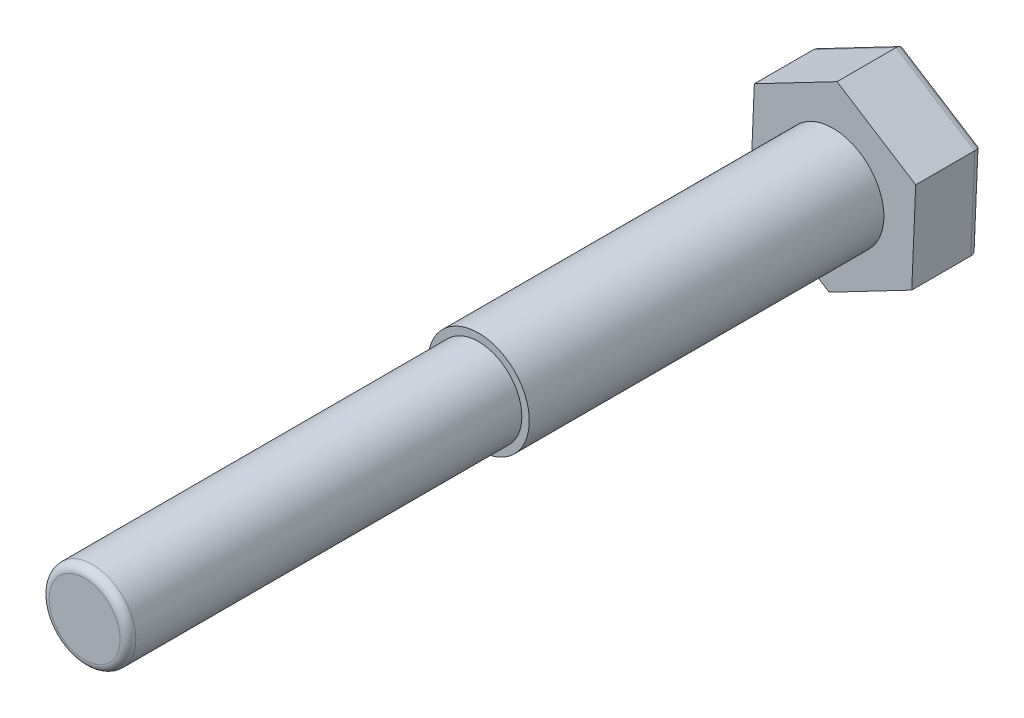
ISO-10303-21;
HEADER;
FILE_DESCRIPTION(('STEP AP214'),'2;1');
FILE_NAME('part.step','',(''),(''),'','','');
FILE_SCHEMA(('AUTOMOTIVE_DESIGN { 1 0 10303 214 1 1 1 1 }'));
ENDSEC;
DATA;
#1=APPLICATION_CONTEXT('core data for automotive mechanical design processes');
#2=APPLICATION_PROTOCOL_DEFINITION('international standard','automotive_design',2000,#1);
#3=PRODUCT_CONTEXT('',#1,'mechanical');
#4=PRODUCT('Part','Part','',(#3));
#5=PRODUCT_RELATED_PRODUCT_CATEGORY('part','',(#4));
#6=PRODUCT_DEFINITION_FORMATION('','',#4);
#7=PRODUCT_DEFINITION_CONTEXT('part definition',#1,'design');
#8=PRODUCT_DEFINITION('design','',#6,#7);
#9=PRODUCT_DEFINITION_SHAPE('','',#8);
#10=(LENGTH_UNIT() NAMED_UNIT(*) SI_UNIT(.MILLI.,.METRE.));
#11=(NAMED_UNIT(*) PLANE_ANGLE_UNIT() SI_UNIT($,.RADIAN.));
#12=(NAMED_UNIT(*) SI_UNIT($,.STERADIAN.) SOLID_ANGLE_UNIT());
#13=UNCERTAINTY_MEASURE_WITH_UNIT(LENGTH_MEASURE(1.E-05),#10,'distance_accuracy_value','');
#14=(GEOMETRIC_REPRESENTATION_CONTEXT(3) GLOBAL_UNCERTAINTY_ASSIGNED_CONTEXT((#13)) GLOBAL_UNIT_ASSIGNED_CONTEXT((#10,
#11,#12)) REPRESENTATION_CONTEXT('',''));
#15=CARTESIAN_POINT('',(0.,0.,0.));
#16=DIRECTION('',(0.,0.,1.));
#17=DIRECTION('',(1.,0.,0.));
#18=AXIS2_PLACEMENT_3D('',#15,#16,#17);
#19=CARTESIAN_POINT('',(0.,0.,107.));
#20=DIRECTION('',(0.,0.,1.));
#21=DIRECTION('',(1.,0.,0.));
#22=AXIS2_PLACEMENT_3D('',#19,#20,#21);
#23=PLANE('',#22);
#24=CARTESIAN_POINT('',(0.,0.,107.));
#25=DIRECTION('',(0.,0.,1.));
#26=DIRECTION('',(1.,0.,0.));
#27=AXIS2_PLACEMENT_3D('',#24,#25,#26);
#28=CIRCLE('',#27,12.9);
#29=CARTESIAN_POINT('',(-12.9,0.,107.));
#30=VERTEX_POINT('',#29);
#31=EDGE_CURVE('E128',#30,#30,#28,.T.);
#32=ORIENTED_EDGE('',*,*,#31,.T.);
#33=EDGE_LOOP('',(#32));
#34=FACE_BOUND('',#33,.T.);
#35=CARTESIAN_POINT('',(0.,0.,107.));
#36=DIRECTION('',(0.,0.,1.));
#37=DIRECTION('',(1.,0.,0.));
#38=AXIS2_PLACEMENT_3D('',#35,#36,#37);
#39=CIRCLE('',#38,11.);
#40=CARTESIAN_POINT('',(11.,0.,107.));
#41=VERTEX_POINT('',#40);
#42=EDGE_CURVE('E166',#41,#41,#39,.T.);
#43=ORIENTED_EDGE('',*,*,#42,.F.);
#44=EDGE_LOOP('',(#43));
#45=FACE_BOUND('',#44,.T.);
#46=ADVANCED_FACE('F34',(#34,#45),#23,.T.);
#47=CARTESIAN_POINT('',(18.9733976863162,-36.3457037383633,17.));
#48=DIRECTION('',(0.,0.,-1.));
#49=DIRECTION('',(-1.,0.,0.));
#50=AXIS2_PLACEMENT_3D('',#47,#48,#49);
#51=PLANE('',#50);
#52=DIRECTION('',(0.0424733530909036,0.999097599975706,0.));
#53=VECTOR('',#52,1.);
#54=CARTESIAN_POINT('',(19.9787997617734,-12.6957037383635,17.));
#55=LINE('',#54,#53);
#56=CARTESIAN_POINT('',(19.9787997617734,-12.6957037383635,17.));
#57=VERTEX_POINT('',#56);
#58=CARTESIAN_POINT('',(20.9842018372306,10.9542962616365,17.));
#59=VERTEX_POINT('',#58);
#60=EDGE_CURVE('E120',#57,#59,#55,.T.);
#61=ORIENTED_EDGE('',*,*,#60,.T.);
#62=DIRECTION('',(-0.844007225893572,0.536331802748482,0.));
#63=VECTOR('',#62,1.);
#64=CARTESIAN_POINT('',(20.9842018372306,10.9542962616365,17.));
#65=LINE('',#64,#63);
#66=CARTESIAN_POINT('',(1.0054020754572,23.65,17.));
#67=VERTEX_POINT('',#66);
#68=EDGE_CURVE('E108',#59,#67,#65,.T.);
#69=ORIENTED_EDGE('',*,*,#68,.T.);
#70=DIRECTION('',(-0.886480578984472,-0.462765797227231,0.));
#71=VECTOR('',#70,1.);
#72=CARTESIAN_POINT('',(1.0054020754572,23.65,17.));
#73=LINE('',#72,#71);
#74=CARTESIAN_POINT('',(-19.9787997617736,12.6957037383632,17.));
#75=VERTEX_POINT('',#74);
#76=EDGE_CURVE('E119',#67,#75,#73,.T.);
#77=ORIENTED_EDGE('',*,*,#76,.T.);
#78=DIRECTION('',(-0.0424733530908878,-0.999097599975706,0.));
#79=VECTOR('',#78,1.);
#80=CARTESIAN_POINT('',(-19.9787997617736,12.6957037383632,17.));
#81=LINE('',#80,#79);
#82=CARTESIAN_POINT('',(-20.9842018372304,-10.9542962616368,17.));
#83=VERTEX_POINT('',#82);
#84=EDGE_CURVE('E270',#75,#83,#81,.T.);
#85=ORIENTED_EDGE('',*,*,#84,.T.);
#86=DIRECTION('',(0.844007225893576,-0.536331802748476,0.));
#87=VECTOR('',#86,1.);
#88=CARTESIAN_POINT('',(-20.9842018372304,-10.9542962616368,17.));
#89=LINE('',#88,#87);
#90=CARTESIAN_POINT('',(-1.00540207545719,-23.65,17.));
#91=VERTEX_POINT('',#90);
#92=EDGE_CURVE('E272',#83,#91,#89,.T.);
#93=ORIENTED_EDGE('',*,*,#92,.T.);
#94=DIRECTION('',(0.886480578984476,0.462765797227224,0.));
#95=VECTOR('',#94,1.);
#96=CARTESIAN_POINT('',(-1.00540207545719,-23.65,17.));
#97=LINE('',#96,#95);
#98=EDGE_CURVE('E126',#91,#57,#97,.T.);
#99=ORIENTED_EDGE('',*,*,#98,.T.);
#100=EDGE_LOOP('',(#61,#69,#77,#85,#93,#99));
#101=FACE_BOUND('',#100,.T.);
#102=CARTESIAN_POINT('',(0.,0.,17.));
#103=DIRECTION('',(0.,0.,-1.));
#104=DIRECTION('',(-1.,0.,0.));
#105=AXIS2_PLACEMENT_3D('',#102,#103,#104);
#106=CIRCLE('',#105,12.9);
#107=CARTESIAN_POINT('',(-12.9,0.,17.));
#108=VERTEX_POINT('',#107);
#109=EDGE_CURVE('E133',#108,#108,#106,.F.);
#110=ORIENTED_EDGE('',*,*,#109,.F.);
#111=EDGE_LOOP('',(#110));
#112=FACE_BOUND('',#111,.T.);
#113=ADVANCED_FACE('F123',(#101,#112),#51,.F.);
#114=CARTESIAN_POINT('',(19.9787997617734,-12.6957037383635,17.));
#115=DIRECTION('',(-0.999097599975706,0.0424733530909036,0.));
#116=DIRECTION('',(-0.0424733530909036,-0.999097599975706,0.));
#117=AXIS2_PLACEMENT_3D('',#114,#115,#116);
#118=PLANE('',#117);
#119=DIRECTION('',(0.,0.,-1.));
#120=VECTOR('',#119,1.);
#121=CARTESIAN_POINT('',(19.9787997617734,-12.6957037383635,17.));
#122=LINE('',#121,#120);
#123=CARTESIAN_POINT('',(19.9787997617734,-12.6957037383635,2.));
#124=VERTEX_POINT('',#123);
#125=EDGE_CURVE('E277',#57,#124,#122,.T.);
#126=ORIENTED_EDGE('',*,*,#125,.T.);
#127=DIRECTION('',(0.0424733530909036,0.999097599975706,0.));
#128=VECTOR('',#127,1.);
#129=CARTESIAN_POINT('',(20.9842018372306,10.9542962616365,2.));
#130=LINE('',#129,#128);
#131=CARTESIAN_POINT('',(20.9842018372306,10.9542962616365,2.));
#132=VERTEX_POINT('',#131);
#133=EDGE_CURVE('E132',#124,#132,#130,.T.);
#134=ORIENTED_EDGE('',*,*,#133,.T.);
#135=DIRECTION('',(0.,0.,-1.));
#136=VECTOR('',#135,1.);
#137=CARTESIAN_POINT('',(20.9842018372306,10.9542962616365,17.));
#138=LINE('',#137,#136);
#139=EDGE_CURVE('E113',#59,#132,#138,.T.);
#140=ORIENTED_EDGE('',*,*,#139,.F.);
#141=ORIENTED_EDGE('',*,*,#60,.F.);
#142=EDGE_LOOP('',(#126,#134,#140,#141));
#143=FACE_BOUND('',#142,.T.);
#144=ADVANCED_FACE('F130',(#143),#118,.F.);
#145=CARTESIAN_POINT('',(20.9842018372306,10.9542962616365,17.));
#146=DIRECTION('',(-0.536331802748482,-0.844007225893572,0.));
#147=DIRECTION('',(0.844007225893572,-0.536331802748482,0.));
#148=AXIS2_PLACEMENT_3D('',#145,#146,#147);
#149=PLANE('',#148);
#150=ORIENTED_EDGE('',*,*,#139,.T.);
#151=DIRECTION('',(-0.844007225893572,0.536331802748482,0.));
#152=VECTOR('',#151,1.);
#153=CARTESIAN_POINT('',(1.00540207545719,23.65,2.));
#154=LINE('',#153,#152);
#155=CARTESIAN_POINT('',(1.0054020754572,23.65,2.));
#156=VERTEX_POINT('',#155);
#157=EDGE_CURVE('E136',#132,#156,#154,.T.);
#158=ORIENTED_EDGE('',*,*,#157,.T.);
#159=DIRECTION('',(0.,0.,-1.));
#160=VECTOR('',#159,1.);
#161=CARTESIAN_POINT('',(1.0054020754572,23.65,17.));
#162=LINE('',#161,#160);
#163=EDGE_CURVE('E116',#67,#156,#162,.T.);
#164=ORIENTED_EDGE('',*,*,#163,.F.);
#165=ORIENTED_EDGE('',*,*,#68,.F.);
#166=EDGE_LOOP('',(#150,#158,#164,#165));
#167=FACE_BOUND('',#166,.T.);
#168=ADVANCED_FACE('F110',(#167),#149,.F.);
#169=CARTESIAN_POINT('',(1.0054020754572,23.65,17.));
#170=DIRECTION('',(0.462765797227231,-0.886480578984472,0.));
#171=DIRECTION('',(0.886480578984472,0.462765797227231,0.));
#172=AXIS2_PLACEMENT_3D('',#169,#170,#171);
#173=PLANE('',#172);
#174=ORIENTED_EDGE('',*,*,#163,.T.);
#175=DIRECTION('',(-0.886480578984472,-0.462765797227231,0.));
#176=VECTOR('',#175,1.);
#177=CARTESIAN_POINT('',(-19.9787997617736,12.6957037383632,2.));
#178=LINE('',#177,#176);
#179=CARTESIAN_POINT('',(-19.9787997617736,12.6957037383632,2.));
#180=VERTEX_POINT('',#179);
#181=EDGE_CURVE('E156',#156,#180,#178,.T.);
#182=ORIENTED_EDGE('',*,*,#181,.T.);
#183=DIRECTION('',(0.,0.,-1.));
#184=VECTOR('',#183,1.);
#185=CARTESIAN_POINT('',(-19.9787997617736,12.6957037383632,17.));
#186=LINE('',#185,#184);
#187=EDGE_CURVE('E138',#75,#180,#186,.T.);
#188=ORIENTED_EDGE('',*,*,#187,.F.);
#189=ORIENTED_EDGE('',*,*,#76,.F.);
#190=EDGE_LOOP('',(#174,#182,#188,#189));
#191=FACE_BOUND('',#190,.T.);
#192=ADVANCED_FACE('F221',(#191),#173,.F.);
#193=CARTESIAN_POINT('',(-19.9787997617736,12.6957037383632,17.));
#194=DIRECTION('',(0.999097599975706,-0.0424733530908878,0.));
#195=DIRECTION('',(0.0424733530908878,0.999097599975707,0.));
#196=AXIS2_PLACEMENT_3D('',#193,#194,#195);
#197=PLANE('',#196);
#198=ORIENTED_EDGE('',*,*,#187,.T.);
#199=DIRECTION('',(-0.0424733530908878,-0.999097599975707,0.));
#200=VECTOR('',#199,1.);
#201=CARTESIAN_POINT('',(-20.9842018372304,-10.9542962616368,2.));
#202=LINE('',#201,#200);
#203=CARTESIAN_POINT('',(-20.9842018372304,-10.9542962616368,2.));
#204=VERTEX_POINT('',#203);
#205=EDGE_CURVE('E158',#180,#204,#202,.T.);
#206=ORIENTED_EDGE('',*,*,#205,.T.);
#207=DIRECTION('',(0.,0.,-1.));
#208=VECTOR('',#207,1.);
#209=CARTESIAN_POINT('',(-20.9842018372304,-10.9542962616368,17.));
#210=LINE('',#209,#208);
#211=EDGE_CURVE('E281',#83,#204,#210,.T.);
#212=ORIENTED_EDGE('',*,*,#211,.F.);
#213=ORIENTED_EDGE('',*,*,#84,.F.);
#214=EDGE_LOOP('',(#198,#206,#212,#213));
#215=FACE_BOUND('',#214,.T.);
#216=ADVANCED_FACE('F218',(#215),#197,.F.);
#217=CARTESIAN_POINT('',(-20.9842018372304,-10.9542962616368,17.));
#218=DIRECTION('',(0.536331802748476,0.844007225893576,0.));
#219=DIRECTION('',(-0.844007225893576,0.536331802748476,0.));
#220=AXIS2_PLACEMENT_3D('',#217,#218,#219);
#221=PLANE('',#220);
#222=ORIENTED_EDGE('',*,*,#211,.T.);
#223=DIRECTION('',(0.844007225893576,-0.536331802748476,0.));
#224=VECTOR('',#223,1.);
#225=CARTESIAN_POINT('',(-1.00540207545719,-23.65,2.));
#226=LINE('',#225,#224);
#227=CARTESIAN_POINT('',(-1.00540207545719,-23.65,2.));
#228=VERTEX_POINT('',#227);
#229=EDGE_CURVE('E57',#204,#228,#226,.T.);
#230=ORIENTED_EDGE('',*,*,#229,.T.);
#231=DIRECTION('',(0.,0.,-1.));
#232=VECTOR('',#231,1.);
#233=CARTESIAN_POINT('',(-1.00540207545719,-23.65,17.));
#234=LINE('',#233,#232);
#235=EDGE_CURVE('E279',#91,#228,#234,.T.);
#236=ORIENTED_EDGE('',*,*,#235,.F.);
#237=ORIENTED_EDGE('',*,*,#92,.F.);
#238=EDGE_LOOP('',(#222,#230,#236,#237));
#239=FACE_BOUND('',#238,.T.);
#240=ADVANCED_FACE('F215',(#239),#221,.F.);
#241=CARTESIAN_POINT('',(-1.00540207545719,-23.65,17.));
#242=DIRECTION('',(-0.462765797227224,0.886480578984476,0.));
#243=DIRECTION('',(-0.886480578984476,-0.462765797227224,0.));
#244=AXIS2_PLACEMENT_3D('',#241,#242,#243);
#245=PLANE('',#244);
#246=ORIENTED_EDGE('',*,*,#235,.T.);
#247=DIRECTION('',(0.886480578984476,0.462765797227224,0.));
#248=VECTOR('',#247,1.);
#249=CARTESIAN_POINT('',(19.9787997617734,-12.6957037383635,2.));
#250=LINE('',#249,#248);
#251=EDGE_CURVE('E49',#228,#124,#250,.T.);
#252=ORIENTED_EDGE('',*,*,#251,.T.);
#253=ORIENTED_EDGE('',*,*,#125,.F.);
#254=ORIENTED_EDGE('',*,*,#98,.F.);
#255=EDGE_LOOP('',(#246,#252,#253,#254));
#256=FACE_BOUND('',#255,.T.);
#257=ADVANCED_FACE('F211',(#256),#245,.F.);
#258=CARTESIAN_POINT('',(18.9733976863162,-36.3457037383633,0.));
#259=DIRECTION('',(0.,0.,-1.));
#260=DIRECTION('',(-1.,0.,0.));
#261=AXIS2_PLACEMENT_3D('',#258,#259,#260);
#262=PLANE('',#261);
#263=DIRECTION('',(-0.886480578984472,-0.462765797227231,0.));
#264=VECTOR('',#263,1.);
#265=CARTESIAN_POINT('',(1.93093366991166,21.8770388420311,0.));
#266=LINE('',#265,#264);
#267=CARTESIAN_POINT('',(-18.029648565503,11.4570984955961,0.));
#268=VERTEX_POINT('',#267);
#269=CARTESIAN_POINT('',(0.907314068095531,21.3426829268293,0.));
#270=VERTEX_POINT('',#269);
#271=EDGE_CURVE('E151',#268,#270,#266,.F.);
#272=ORIENTED_EDGE('',*,*,#271,.T.);
#273=DIRECTION('',(-0.844007225893572,0.536331802748482,0.));
#274=VECTOR('',#273,1.);
#275=CARTESIAN_POINT('',(19.9115382317336,9.26628180984933,0.));
#276=LINE('',#275,#274);
#277=CARTESIAN_POINT('',(18.9369626335983,9.88558443123292,0.));
#278=VERTEX_POINT('',#277);
#279=EDGE_CURVE('E153',#270,#278,#276,.F.);
#280=ORIENTED_EDGE('',*,*,#279,.T.);
#281=DIRECTION('',(0.0424733530909036,0.999097599975706,0.));
#282=VECTOR('',#281,1.);
#283=CARTESIAN_POINT('',(17.980604561822,-12.6107570321817,0.));
#284=LINE('',#283,#282);
#285=CARTESIAN_POINT('',(18.0296485655028,-11.4570984955964,0.));
#286=VERTEX_POINT('',#285);
#287=EDGE_CURVE('E143',#278,#286,#284,.F.);
#288=ORIENTED_EDGE('',*,*,#287,.T.);
#289=DIRECTION('',(0.886480578984476,0.462765797227224,0.));
#290=VECTOR('',#289,1.);
#291=CARTESIAN_POINT('',(-1.93093366991164,-21.877038842031,0.));
#292=LINE('',#291,#290);
#293=CARTESIAN_POINT('',(-0.90731406809552,-21.3426829268293,0.));
#294=VERTEX_POINT('',#293);
#295=EDGE_CURVE('E145',#286,#294,#292,.F.);
#296=ORIENTED_EDGE('',*,*,#295,.T.);
#297=DIRECTION('',(0.844007225893576,-0.536331802748476,0.));
#298=VECTOR('',#297,1.);
#299=CARTESIAN_POINT('',(-19.9115382317334,-9.26628180984964,0.));
#300=LINE('',#299,#298);
#301=CARTESIAN_POINT('',(-18.9369626335981,-9.88558443123322,0.));
#302=VERTEX_POINT('',#301);
#303=EDGE_CURVE('E147',#294,#302,#300,.F.);
#304=ORIENTED_EDGE('',*,*,#303,.T.);
#305=DIRECTION('',(-0.0424733530908878,-0.999097599975707,0.));
#306=VECTOR('',#305,1.);
#307=CARTESIAN_POINT('',(-17.9806045618221,12.6107570321814,0.));
#308=LINE('',#307,#306);
#309=EDGE_CURVE('E149',#302,#268,#308,.F.);
#310=ORIENTED_EDGE('',*,*,#309,.T.);
#311=EDGE_LOOP('',(#272,#280,#288,#296,#304,#310));
#312=FACE_BOUND('',#311,.T.);
#313=ADVANCED_FACE('F206',(#312),#262,.T.);
#314=CARTESIAN_POINT('',(0.,0.,107.));
#315=DIRECTION('',(0.,0.,-1.));
#316=DIRECTION('',(-1.,0.,0.));
#317=AXIS2_PLACEMENT_3D('',#314,#315,#316);
#318=CYLINDRICAL_SURFACE('',#317,12.9);
#319=CARTESIAN_POINT('',(-12.9,0.,107.));
#320=CARTESIAN_POINT('',(-12.9,0.,106.0625));
#321=CARTESIAN_POINT('',(-12.9,0.,105.125));
#322=CARTESIAN_POINT('',(-12.9,0.,103.25));
#323=CARTESIAN_POINT('',(-12.9,0.,102.3125));
#324=CARTESIAN_POINT('',(-12.9,0.,100.4375));
#325=CARTESIAN_POINT('',(-12.9,0.,99.5));
#326=CARTESIAN_POINT('',(-12.9,0.,97.625));
#327=CARTESIAN_POINT('',(-12.9,0.,96.6875));
#328=CARTESIAN_POINT('',(-12.9,0.,94.8125));
#329=CARTESIAN_POINT('',(-12.9,0.,93.875));
#330=CARTESIAN_POINT('',(-12.9,0.,92.));
#331=CARTESIAN_POINT('',(-12.9,0.,91.0625));
#332=CARTESIAN_POINT('',(-12.9,0.,89.1875));
#333=CARTESIAN_POINT('',(-12.9,0.,88.25));
#334=CARTESIAN_POINT('',(-12.9,0.,86.375));
#335=CARTESIAN_POINT('',(-12.9,0.,85.4375));
#336=CARTESIAN_POINT('',(-12.9,0.,83.5625));
#337=CARTESIAN_POINT('',(-12.9,0.,82.625));
#338=CARTESIAN_POINT('',(-12.9,0.,80.75));
#339=CARTESIAN_POINT('',(-12.9,0.,79.8125));
#340=CARTESIAN_POINT('',(-12.9,0.,77.9375));
#341=CARTESIAN_POINT('',(-12.9,0.,77.));
#342=CARTESIAN_POINT('',(-12.9,0.,75.125));
#343=CARTESIAN_POINT('',(-12.9,0.,74.1875));
#344=CARTESIAN_POINT('',(-12.9,0.,72.3125));
#345=CARTESIAN_POINT('',(-12.9,0.,71.375));
#346=CARTESIAN_POINT('',(-12.9,0.,69.5));
#347=CARTESIAN_POINT('',(-12.9,0.,68.5625));
#348=CARTESIAN_POINT('',(-12.9,0.,66.6875));
#349=CARTESIAN_POINT('',(-12.9,0.,65.75));
#350=CARTESIAN_POINT('',(-12.9,0.,63.875));
#351=CARTESIAN_POINT('',(-12.9,0.,62.9375));
#352=CARTESIAN_POINT('',(-12.9,0.,61.0625));
#353=CARTESIAN_POINT('',(-12.9,0.,60.125));
#354=CARTESIAN_POINT('',(-12.9,0.,58.25));
#355=CARTESIAN_POINT('',(-12.9,0.,57.3125));
#356=CARTESIAN_POINT('',(-12.9,0.,55.4375));
#357=CARTESIAN_POINT('',(-12.9,0.,54.5));
#358=CARTESIAN_POINT('',(-12.9,0.,52.625));
#359=CARTESIAN_POINT('',(-12.9,0.,51.6875));
#360=CARTESIAN_POINT('',(-12.9,0.,49.8125));
#361=CARTESIAN_POINT('',(-12.9,0.,48.875));
#362=CARTESIAN_POINT('',(-12.9,0.,47.));
#363=CARTESIAN_POINT('',(-12.9,0.,46.0625));
#364=CARTESIAN_POINT('',(-12.9,0.,44.1875));
#365=CARTESIAN_POINT('',(-12.9,0.,43.25));
#366=CARTESIAN_POINT('',(-12.9,0.,41.375));
#367=CARTESIAN_POINT('',(-12.9,0.,40.4375));
#368=CARTESIAN_POINT('',(-12.9,0.,38.5625));
#369=CARTESIAN_POINT('',(-12.9,0.,37.625));
#370=CARTESIAN_POINT('',(-12.9,0.,35.75));
#371=CARTESIAN_POINT('',(-12.9,0.,34.8125));
#372=CARTESIAN_POINT('',(-12.9,0.,32.9375));
#373=CARTESIAN_POINT('',(-12.9,0.,32.));
#374=CARTESIAN_POINT('',(-12.9,0.,30.125));
#375=CARTESIAN_POINT('',(-12.9,0.,29.1875));
#376=CARTESIAN_POINT('',(-12.9,0.,27.3125));
#377=CARTESIAN_POINT('',(-12.9,0.,26.375));
#378=CARTESIAN_POINT('',(-12.9,0.,24.5));
#379=CARTESIAN_POINT('',(-12.9,0.,23.5625));
#380=CARTESIAN_POINT('',(-12.9,0.,21.6875));
#381=CARTESIAN_POINT('',(-12.9,0.,20.75));
#382=CARTESIAN_POINT('',(-12.9,0.,18.875));
#383=CARTESIAN_POINT('',(-12.9,0.,17.9375));
#384=CARTESIAN_POINT('',(-12.9,0.,17.));
#385=B_SPLINE_CURVE_WITH_KNOTS('',3,(#319,#320,#321,#322,#323,#324,#325,#326,#327,#328,#329,
#330,#331,#332,#333,#334,#335,#336,#337,#338,#339,#340,#341,#342,#343,#344,#345,#346,#347,#348,
#349,#350,#351,#352,#353,#354,#355,#356,#357,#358,#359,#360,#361,#362,#363,#364,#365,#366,#367,
#368,#369,#370,#371,#372,#373,#374,#375,#376,#377,#378,#379,#380,#381,#382,#383,#384),
.UNSPECIFIED.,.F.,.F.,(4,2,2,2,2,2,2,2,2,2,2,2,2,2,2,2,2,2,2,2,2,2,2,2,2,2,2,2,2,2,2,2,4),(0.,
2.81250000000001,5.62500000000001,8.4375,11.25,14.0625,16.875,19.6875,22.5,25.3125,28.125,
30.9375,33.75,36.5625,39.375,42.1875,45.,47.8125,50.625,53.4375,56.25,59.0625,61.875,64.6875,
67.5,70.3125,73.125,75.9375,78.75,81.5625,84.375,87.1875,90.),.UNSPECIFIED.);
#386=EDGE_CURVE('BSEAM203',#30,#108,#385,.T.);
#387=ORIENTED_EDGE('',*,*,#31,.F.);
#388=ORIENTED_EDGE('',*,*,#109,.T.);
#389=ORIENTED_EDGE('',*,*,#386,.T.);
#390=ORIENTED_EDGE('',*,*,#386,.F.);
#391=EDGE_LOOP('',(#387,#389,#388,#390));
#392=FACE_BOUND('',#391,.T.);
#393=ADVANCED_FACE('F203',(#392),#318,.T.);
#394=CARTESIAN_POINT('',(-19.9115382317334,-9.26628180984964,2.));
#395=DIRECTION('',(-0.844007225893576,0.536331802748476,0.));
#396=DIRECTION('',(-0.536331802748476,-0.844007225893576,0.));
#397=AXIS2_PLACEMENT_3D('',#394,#395,#396);
#398=CYLINDRICAL_SURFACE('',#397,2.);
#399=CARTESIAN_POINT('',(-18.9369626335981,-9.88558443123322,2.));
#400=DIRECTION('',(-0.462765797227234,0.886480578984471,0.));
#401=DIRECTION('',(-0.886480578984471,-0.462765797227234,0.));
#402=AXIS2_PLACEMENT_3D('',#399,#400,#401);
#403=ELLIPSE('',#402,2.3094010767585,2.);
#404=EDGE_CURVE('E174',#302,#204,#403,.T.);
#405=ORIENTED_EDGE('',*,*,#404,.F.);
#406=ORIENTED_EDGE('',*,*,#303,.F.);
#407=CARTESIAN_POINT('',(-0.90731406809552,-21.3426829268293,2.));
#408=DIRECTION('',(-0.999097599975706,0.0424733530909003,0.));
#409=DIRECTION('',(-0.0424733530909002,-0.999097599975706,0.));
#410=AXIS2_PLACEMENT_3D('',#407,#408,#409);
#411=ELLIPSE('',#410,2.3094010767585,2.);
#412=EDGE_CURVE('E177',#228,#294,#411,.F.);
#413=ORIENTED_EDGE('',*,*,#412,.F.);
#414=ORIENTED_EDGE('',*,*,#229,.F.);
#415=EDGE_LOOP('',(#405,#406,#413,#414));
#416=FACE_BOUND('',#415,.T.);
#417=ADVANCED_FACE('F205',(#416),#398,.T.);
#418=CARTESIAN_POINT('',(-1.93093366991164,-21.877038842031,2.));
#419=DIRECTION('',(-0.886480578984476,-0.462765797227224,0.));
#420=DIRECTION('',(0.462765797227224,-0.886480578984476,0.));
#421=AXIS2_PLACEMENT_3D('',#418,#419,#420);
#422=CYLINDRICAL_SURFACE('',#421,2.);
#423=ORIENTED_EDGE('',*,*,#412,.T.);
#424=ORIENTED_EDGE('',*,*,#295,.F.);
#425=CARTESIAN_POINT('',(18.0296485655028,-11.4570984955964,2.));
#426=DIRECTION('',(-0.536331802748482,-0.844007225893572,0.));
#427=DIRECTION('',(0.844007225893572,-0.536331802748482,0.));
#428=AXIS2_PLACEMENT_3D('',#425,#426,#427);
#429=ELLIPSE('',#428,2.3094010767585,2.);
#430=EDGE_CURVE('E171',#124,#286,#429,.F.);
#431=ORIENTED_EDGE('',*,*,#430,.F.);
#432=ORIENTED_EDGE('',*,*,#251,.F.);
#433=EDGE_LOOP('',(#423,#424,#431,#432));
#434=FACE_BOUND('',#433,.T.);
#435=ADVANCED_FACE('F245',(#434),#422,.T.);
#436=CARTESIAN_POINT('',(-17.9806045618221,12.6107570321814,2.));
#437=DIRECTION('',(0.0424733530908878,0.999097599975707,0.));
#438=DIRECTION('',(-0.999097599975707,0.0424733530908878,0.));
#439=AXIS2_PLACEMENT_3D('',#436,#437,#438);
#440=CYLINDRICAL_SURFACE('',#439,2.);
#441=ORIENTED_EDGE('',*,*,#404,.T.);
#442=ORIENTED_EDGE('',*,*,#205,.F.);
#443=CARTESIAN_POINT('',(-18.029648565503,11.457098495596,2.));
#444=DIRECTION('',(0.536331802748472,0.844007225893579,0.));
#445=DIRECTION('',(-0.844007225893579,0.536331802748472,0.));
#446=AXIS2_PLACEMENT_3D('',#443,#444,#445);
#447=ELLIPSE('',#446,2.30940107675851,2.);
#448=EDGE_CURVE('E168',#268,#180,#447,.T.);
#449=ORIENTED_EDGE('',*,*,#448,.F.);
#450=ORIENTED_EDGE('',*,*,#309,.F.);
#451=EDGE_LOOP('',(#441,#442,#449,#450));
#452=FACE_BOUND('',#451,.T.);
#453=ADVANCED_FACE('F241',(#452),#440,.T.);
#454=CARTESIAN_POINT('',(17.980604561822,-12.6107570321817,2.));
#455=DIRECTION('',(-0.0424733530909036,-0.999097599975706,0.));
#456=DIRECTION('',(0.999097599975706,-0.0424733530909036,0.));
#457=AXIS2_PLACEMENT_3D('',#454,#455,#456);
#458=CYLINDRICAL_SURFACE('',#457,2.);
#459=ORIENTED_EDGE('',*,*,#430,.T.);
#460=ORIENTED_EDGE('',*,*,#287,.F.);
#461=CARTESIAN_POINT('',(18.9369626335983,9.88558443123291,2.));
#462=DIRECTION('',(0.462765797227224,-0.886480578984476,0.));
#463=DIRECTION('',(-0.886480578984476,-0.462765797227224,0.));
#464=AXIS2_PLACEMENT_3D('',#461,#462,#463);
#465=ELLIPSE('',#464,2.3094010767585,2.);
#466=EDGE_CURVE('E165',#132,#278,#465,.F.);
#467=ORIENTED_EDGE('',*,*,#466,.F.);
#468=ORIENTED_EDGE('',*,*,#133,.F.);
#469=EDGE_LOOP('',(#459,#460,#467,#468));
#470=FACE_BOUND('',#469,.T.);
#471=ADVANCED_FACE('F237',(#470),#458,.T.);
#472=CARTESIAN_POINT('',(1.93093366991166,21.8770388420311,2.));
#473=DIRECTION('',(0.886480578984472,0.462765797227231,0.));
#474=DIRECTION('',(-0.462765797227231,0.886480578984472,0.));
#475=AXIS2_PLACEMENT_3D('',#472,#473,#474);
#476=CYLINDRICAL_SURFACE('',#475,2.);
#477=ORIENTED_EDGE('',*,*,#448,.T.);
#478=ORIENTED_EDGE('',*,*,#181,.F.);
#479=CARTESIAN_POINT('',(0.907314068095525,21.3426829268293,2.));
#480=DIRECTION('',(0.999097599975706,-0.0424733530908997,0.));
#481=DIRECTION('',(0.0424733530908995,0.999097599975706,0.));
#482=AXIS2_PLACEMENT_3D('',#479,#480,#481);
#483=ELLIPSE('',#482,2.30940107675851,2.);
#484=EDGE_CURVE('E163',#270,#156,#483,.T.);
#485=ORIENTED_EDGE('',*,*,#484,.F.);
#486=ORIENTED_EDGE('',*,*,#271,.F.);
#487=EDGE_LOOP('',(#477,#478,#485,#486));
#488=FACE_BOUND('',#487,.T.);
#489=ADVANCED_FACE('F233',(#488),#476,.T.);
#490=CARTESIAN_POINT('',(19.9115382317336,9.26628180984933,2.));
#491=DIRECTION('',(0.844007225893572,-0.536331802748482,0.));
#492=DIRECTION('',(0.536331802748482,0.844007225893572,0.));
#493=AXIS2_PLACEMENT_3D('',#490,#491,#492);
#494=CYLINDRICAL_SURFACE('',#493,2.);
#495=ORIENTED_EDGE('',*,*,#466,.T.);
#496=ORIENTED_EDGE('',*,*,#279,.F.);
#497=ORIENTED_EDGE('',*,*,#484,.T.);
#498=ORIENTED_EDGE('',*,*,#157,.F.);
#499=EDGE_LOOP('',(#495,#496,#497,#498));
#500=FACE_BOUND('',#499,.T.);
#501=ADVANCED_FACE('F230',(#500),#494,.T.);
#502=CARTESIAN_POINT('',(0.,0.,207.));
#503=DIRECTION('',(0.,0.,-1.));
#504=DIRECTION('',(-1.,0.,0.));
#505=AXIS2_PLACEMENT_3D('',#502,#503,#504);
#506=CYLINDRICAL_SURFACE('',#505,11.);
#507=CARTESIAN_POINT('',(0.,0.,205.));
#508=DIRECTION('',(0.,0.,1.));
#509=DIRECTION('',(1.,0.,0.));
#510=AXIS2_PLACEMENT_3D('',#507,#508,#509);
#511=CIRCLE('',#510,11.);
#512=CARTESIAN_POINT('',(11.,0.,205.));
#513=VERTEX_POINT('',#512);
#514=EDGE_CURVE('E11',#513,#513,#511,.F.);
#515=ORIENTED_EDGE('',*,*,#514,.T.);
#516=EDGE_LOOP('',(#515));
#517=FACE_BOUND('',#516,.T.);
#518=ORIENTED_EDGE('',*,*,#42,.T.);
#519=EDGE_LOOP('',(#518));
#520=FACE_BOUND('',#519,.T.);
#521=ADVANCED_FACE('F189',(#517,#520),#506,.T.);
#522=CARTESIAN_POINT('',(0.,0.,207.));
#523=DIRECTION('',(0.,0.,1.));
#524=DIRECTION('',(1.,0.,0.));
#525=AXIS2_PLACEMENT_3D('',#522,#523,#524);
#526=PLANE('',#525);
#527=CARTESIAN_POINT('',(0.,0.,207.));
#528=DIRECTION('',(0.,0.,1.));
#529=DIRECTION('',(1.,0.,0.));
#530=AXIS2_PLACEMENT_3D('',#527,#528,#529);
#531=CIRCLE('',#530,9.);
#532=CARTESIAN_POINT('',(9.,0.,207.));
#533=VERTEX_POINT('',#532);
#534=EDGE_CURVE('E42',#533,#533,#531,.T.);
#535=ORIENTED_EDGE('',*,*,#534,.T.);
#536=EDGE_LOOP('',(#535));
#537=FACE_BOUND('',#536,.T.);
#538=ADVANCED_FACE('F182',(#537),#526,.T.);
#539=CARTESIAN_POINT('',(0.,0.,205.));
#540=DIRECTION('',(0.,0.,1.));
#541=DIRECTION('',(1.,0.,0.));
#542=AXIS2_PLACEMENT_3D('',#539,#540,#541);
#543=TOROIDAL_SURFACE('',#542,9.,2.);
#544=ORIENTED_EDGE('',*,*,#514,.F.);
#545=EDGE_LOOP('',(#544));
#546=FACE_BOUND('',#545,.T.);
#547=ORIENTED_EDGE('',*,*,#534,.F.);
#548=EDGE_LOOP('',(#547));
#549=FACE_BOUND('',#548,.T.);
#550=ADVANCED_FACE('F36',(#546,#549),#543,.T.);
#551=CLOSED_SHELL('',(#46,#113,#144,#168,#192,#216,#240,#257,#313,#393,#417,#435,#453,#471,#489,
#501,#521,#538,#550));
#552=MANIFOLD_SOLID_BREP('B2',#551);
#553=ADVANCED_BREP_SHAPE_REPRESENTATION('',(#18,#552),#14);
#554=SHAPE_DEFINITION_REPRESENTATION(#9,#553);
ENDSEC;
END-ISO-10303-21;
